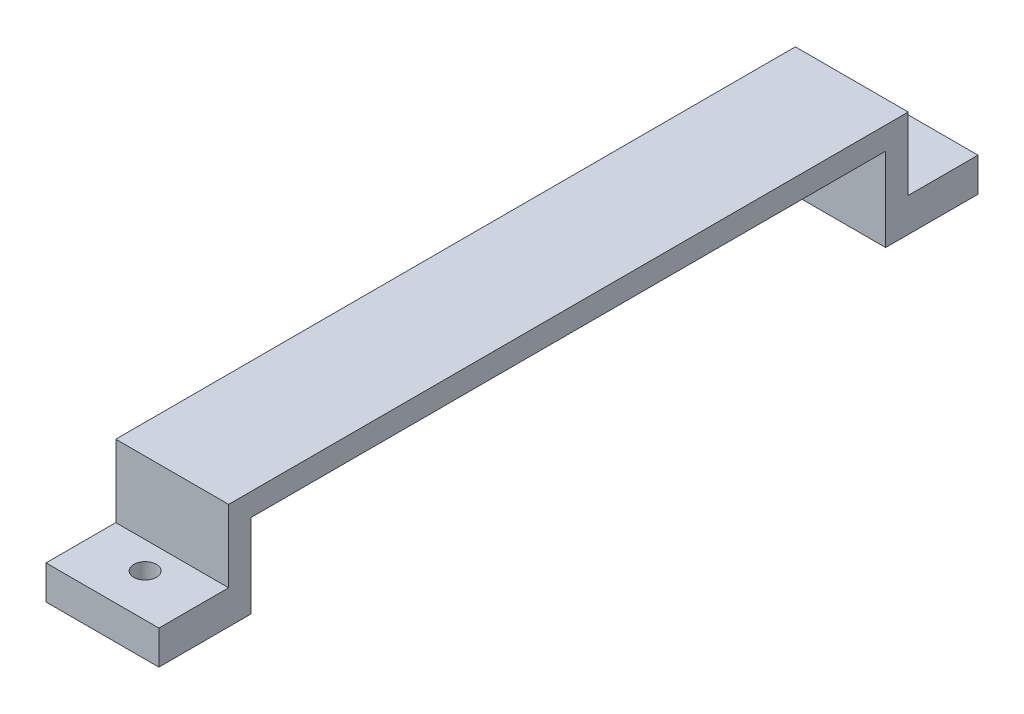
ISO-10303-21;
HEADER;
FILE_DESCRIPTION(('STEP AP214'),'2;1');
FILE_NAME('part.step','',(''),(''),'','','');
FILE_SCHEMA(('AUTOMOTIVE_DESIGN { 1 0 10303 214 1 1 1 1 }'));
ENDSEC;
DATA;
#1=APPLICATION_CONTEXT('core data for automotive mechanical design processes');
#2=APPLICATION_PROTOCOL_DEFINITION('international standard','automotive_design',2000,#1);
#3=PRODUCT_CONTEXT('',#1,'mechanical');
#4=PRODUCT('Part','Part','',(#3));
#5=PRODUCT_RELATED_PRODUCT_CATEGORY('part','',(#4));
#6=PRODUCT_DEFINITION_FORMATION('','',#4);
#7=PRODUCT_DEFINITION_CONTEXT('part definition',#1,'design');
#8=PRODUCT_DEFINITION('design','',#6,#7);
#9=PRODUCT_DEFINITION_SHAPE('','',#8);
#10=(LENGTH_UNIT() NAMED_UNIT(*) SI_UNIT(.MILLI.,.METRE.));
#11=(NAMED_UNIT(*) PLANE_ANGLE_UNIT() SI_UNIT($,.RADIAN.));
#12=(NAMED_UNIT(*) SI_UNIT($,.STERADIAN.) SOLID_ANGLE_UNIT());
#13=UNCERTAINTY_MEASURE_WITH_UNIT(LENGTH_MEASURE(1.E-05),#10,'distance_accuracy_value','');
#14=(GEOMETRIC_REPRESENTATION_CONTEXT(3) GLOBAL_UNCERTAINTY_ASSIGNED_CONTEXT((#13)) GLOBAL_UNIT_ASSIGNED_CONTEXT((#10,
#11,#12)) REPRESENTATION_CONTEXT('',''));
#15=CARTESIAN_POINT('',(0.,0.,0.));
#16=DIRECTION('',(0.,0.,1.));
#17=DIRECTION('',(1.,0.,0.));
#18=AXIS2_PLACEMENT_3D('',#15,#16,#17);
#19=CARTESIAN_POINT('',(5.,1.5,0.));
#20=DIRECTION('',(1.,0.,0.));
#21=DIRECTION('',(0.,0.,-1.));
#22=AXIS2_PLACEMENT_3D('',#19,#20,#21);
#23=PLANE('',#22);
#24=DIRECTION('',(0.,0.,1.));
#25=VECTOR('',#24,1.);
#26=CARTESIAN_POINT('',(5.,1.5,0.));
#27=LINE('',#26,#25);
#28=CARTESIAN_POINT('',(5.,1.5,0.));
#29=VERTEX_POINT('',#28);
#30=CARTESIAN_POINT('',(5.,1.5,3.09));
#31=VERTEX_POINT('',#30);
#32=EDGE_CURVE('E247',#29,#31,#27,.T.);
#33=ORIENTED_EDGE('',*,*,#32,.T.);
#34=DIRECTION('',(0.,-1.,0.));
#35=VECTOR('',#34,1.);
#36=CARTESIAN_POINT('',(5.,3.7,3.09));
#37=LINE('',#36,#35);
#38=CARTESIAN_POINT('',(5.,4.7,3.09));
#39=VERTEX_POINT('',#38);
#40=EDGE_CURVE('E132',#39,#31,#37,.T.);
#41=ORIENTED_EDGE('',*,*,#40,.F.);
#42=DIRECTION('',(0.,0.,-1.));
#43=VECTOR('',#42,1.);
#44=CARTESIAN_POINT('',(5.,4.7,3.09));
#45=LINE('',#44,#43);
#46=CARTESIAN_POINT('',(5.,4.7,33.19));
#47=VERTEX_POINT('',#46);
#48=EDGE_CURVE('E125',#47,#39,#45,.T.);
#49=ORIENTED_EDGE('',*,*,#48,.F.);
#50=DIRECTION('',(0.,-1.,0.));
#51=VECTOR('',#50,1.);
#52=CARTESIAN_POINT('',(5.,3.7,33.19));
#53=LINE('',#52,#51);
#54=CARTESIAN_POINT('',(5.,1.5,33.19));
#55=VERTEX_POINT('',#54);
#56=EDGE_CURVE('E129',#47,#55,#53,.T.);
#57=ORIENTED_EDGE('',*,*,#56,.T.);
#58=DIRECTION('',(0.,0.,-1.));
#59=VECTOR('',#58,1.);
#60=CARTESIAN_POINT('',(5.,1.5,36.28));
#61=LINE('',#60,#59);
#62=CARTESIAN_POINT('',(5.,1.5,36.28));
#63=VERTEX_POINT('',#62);
#64=EDGE_CURVE('E160',#63,#55,#61,.T.);
#65=ORIENTED_EDGE('',*,*,#64,.F.);
#66=DIRECTION('',(0.,-1.,0.));
#67=VECTOR('',#66,1.);
#68=CARTESIAN_POINT('',(5.,1.5,36.28));
#69=LINE('',#68,#67);
#70=CARTESIAN_POINT('',(5.,0.,36.28));
#71=VERTEX_POINT('',#70);
#72=EDGE_CURVE('E183',#63,#71,#69,.T.);
#73=ORIENTED_EDGE('',*,*,#72,.T.);
#74=DIRECTION('',(0.,0.,-1.));
#75=VECTOR('',#74,1.);
#76=CARTESIAN_POINT('',(5.,0.,36.28));
#77=LINE('',#76,#75);
#78=CARTESIAN_POINT('',(5.,0.,32.19));
#79=VERTEX_POINT('',#78);
#80=EDGE_CURVE('E171',#71,#79,#77,.T.);
#81=ORIENTED_EDGE('',*,*,#80,.T.);
#82=DIRECTION('',(0.,-1.,0.));
#83=VECTOR('',#82,1.);
#84=CARTESIAN_POINT('',(5.,1.5,32.19));
#85=LINE('',#84,#83);
#86=CARTESIAN_POINT('',(5.,3.7,32.19));
#87=VERTEX_POINT('',#86);
#88=EDGE_CURVE('E168',#87,#79,#85,.T.);
#89=ORIENTED_EDGE('',*,*,#88,.F.);
#90=DIRECTION('',(0.,0.,-1.));
#91=VECTOR('',#90,1.);
#92=CARTESIAN_POINT('',(5.,3.7,3.09));
#93=LINE('',#92,#91);
#94=CARTESIAN_POINT('',(5.,3.7,4.09));
#95=VERTEX_POINT('',#94);
#96=EDGE_CURVE('E199',#87,#95,#93,.T.);
#97=ORIENTED_EDGE('',*,*,#96,.T.);
#98=DIRECTION('',(0.,-1.,0.));
#99=VECTOR('',#98,1.);
#100=CARTESIAN_POINT('',(5.,1.5,4.09));
#101=LINE('',#100,#99);
#102=CARTESIAN_POINT('',(5.,0.,4.09));
#103=VERTEX_POINT('',#102);
#104=EDGE_CURVE('E218',#95,#103,#101,.T.);
#105=ORIENTED_EDGE('',*,*,#104,.T.);
#106=DIRECTION('',(0.,0.,1.));
#107=VECTOR('',#106,1.);
#108=CARTESIAN_POINT('',(5.,0.,0.));
#109=LINE('',#108,#107);
#110=CARTESIAN_POINT('',(5.,0.,0.));
#111=VERTEX_POINT('',#110);
#112=EDGE_CURVE('E238',#111,#103,#109,.T.);
#113=ORIENTED_EDGE('',*,*,#112,.F.);
#114=DIRECTION('',(0.,-1.,0.));
#115=VECTOR('',#114,1.);
#116=CARTESIAN_POINT('',(5.,1.5,0.));
#117=LINE('',#116,#115);
#118=EDGE_CURVE('E11',#29,#111,#117,.T.);
#119=ORIENTED_EDGE('',*,*,#118,.F.);
#120=EDGE_LOOP('',(#33,#41,#49,#57,#65,#73,#81,#89,#97,#105,#113,#119));
#121=FACE_BOUND('',#120,.T.);
#122=ADVANCED_FACE('F35',(#121),#23,.T.);
#123=CARTESIAN_POINT('',(0.,1.5,0.));
#124=DIRECTION('',(0.,0.,-1.));
#125=DIRECTION('',(-1.,0.,0.));
#126=AXIS2_PLACEMENT_3D('',#123,#124,#125);
#127=PLANE('',#126);
#128=DIRECTION('',(1.,0.,0.));
#129=VECTOR('',#128,1.);
#130=CARTESIAN_POINT('',(0.,0.,0.));
#131=LINE('',#130,#129);
#132=CARTESIAN_POINT('',(0.,0.,0.));
#133=VERTEX_POINT('',#132);
#134=EDGE_CURVE('E235',#133,#111,#131,.T.);
#135=ORIENTED_EDGE('',*,*,#134,.F.);
#136=DIRECTION('',(0.,-1.,0.));
#137=VECTOR('',#136,1.);
#138=CARTESIAN_POINT('',(0.,1.5,0.));
#139=LINE('',#138,#137);
#140=CARTESIAN_POINT('',(0.,1.5,0.));
#141=VERTEX_POINT('',#140);
#142=EDGE_CURVE('E44',#141,#133,#139,.T.);
#143=ORIENTED_EDGE('',*,*,#142,.F.);
#144=DIRECTION('',(1.,0.,0.));
#145=VECTOR('',#144,1.);
#146=CARTESIAN_POINT('',(0.,1.5,0.));
#147=LINE('',#146,#145);
#148=EDGE_CURVE('E244',#141,#29,#147,.T.);
#149=ORIENTED_EDGE('',*,*,#148,.T.);
#150=ORIENTED_EDGE('',*,*,#118,.T.);
#151=EDGE_LOOP('',(#135,#143,#149,#150));
#152=FACE_BOUND('',#151,.T.);
#153=ADVANCED_FACE('F270',(#152),#127,.T.);
#154=CARTESIAN_POINT('',(0.,1.5,0.));
#155=DIRECTION('',(1.,0.,0.));
#156=DIRECTION('',(0.,0.,-1.));
#157=AXIS2_PLACEMENT_3D('',#154,#155,#156);
#158=PLANE('',#157);
#159=DIRECTION('',(0.,0.,1.));
#160=VECTOR('',#159,1.);
#161=CARTESIAN_POINT('',(0.,0.,0.));
#162=LINE('',#161,#160);
#163=CARTESIAN_POINT('',(0.,0.,4.09));
#164=VERTEX_POINT('',#163);
#165=EDGE_CURVE('E233',#133,#164,#162,.T.);
#166=ORIENTED_EDGE('',*,*,#165,.T.);
#167=DIRECTION('',(0.,-1.,0.));
#168=VECTOR('',#167,1.);
#169=CARTESIAN_POINT('',(0.,1.5,4.09));
#170=LINE('',#169,#168);
#171=CARTESIAN_POINT('',(0.,3.7,4.09));
#172=VERTEX_POINT('',#171);
#173=EDGE_CURVE('E221',#172,#164,#170,.T.);
#174=ORIENTED_EDGE('',*,*,#173,.F.);
#175=DIRECTION('',(0.,0.,1.));
#176=VECTOR('',#175,1.);
#177=CARTESIAN_POINT('',(0.,3.7,3.09));
#178=LINE('',#177,#176);
#179=CARTESIAN_POINT('',(0.,3.7,32.19));
#180=VERTEX_POINT('',#179);
#181=EDGE_CURVE('E187',#172,#180,#178,.T.);
#182=ORIENTED_EDGE('',*,*,#181,.T.);
#183=DIRECTION('',(0.,-1.,0.));
#184=VECTOR('',#183,1.);
#185=CARTESIAN_POINT('',(0.,1.5,32.19));
#186=LINE('',#185,#184);
#187=CARTESIAN_POINT('',(0.,0.,32.19));
#188=VERTEX_POINT('',#187);
#189=EDGE_CURVE('E184',#180,#188,#186,.T.);
#190=ORIENTED_EDGE('',*,*,#189,.T.);
#191=DIRECTION('',(0.,0.,-1.));
#192=VECTOR('',#191,1.);
#193=CARTESIAN_POINT('',(0.,0.,36.28));
#194=LINE('',#193,#192);
#195=CARTESIAN_POINT('',(0.,0.,36.28));
#196=VERTEX_POINT('',#195);
#197=EDGE_CURVE('E176',#196,#188,#194,.T.);
#198=ORIENTED_EDGE('',*,*,#197,.F.);
#199=DIRECTION('',(0.,-1.,0.));
#200=VECTOR('',#199,1.);
#201=CARTESIAN_POINT('',(0.,1.5,36.28));
#202=LINE('',#201,#200);
#203=CARTESIAN_POINT('',(0.,1.5,36.28));
#204=VERTEX_POINT('',#203);
#205=EDGE_CURVE('E180',#204,#196,#202,.T.);
#206=ORIENTED_EDGE('',*,*,#205,.F.);
#207=DIRECTION('',(0.,0.,-1.));
#208=VECTOR('',#207,1.);
#209=CARTESIAN_POINT('',(0.,1.5,36.28));
#210=LINE('',#209,#208);
#211=CARTESIAN_POINT('',(0.,1.5,33.19));
#212=VERTEX_POINT('',#211);
#213=EDGE_CURVE('E165',#204,#212,#210,.T.);
#214=ORIENTED_EDGE('',*,*,#213,.T.);
#215=DIRECTION('',(0.,-1.,0.));
#216=VECTOR('',#215,1.);
#217=CARTESIAN_POINT('',(0.,3.7,33.19));
#218=LINE('',#217,#216);
#219=CARTESIAN_POINT('',(0.,4.7,33.19));
#220=VERTEX_POINT('',#219);
#221=EDGE_CURVE('E150',#220,#212,#218,.T.);
#222=ORIENTED_EDGE('',*,*,#221,.F.);
#223=DIRECTION('',(0.,0.,1.));
#224=VECTOR('',#223,1.);
#225=CARTESIAN_POINT('',(0.,4.7,3.09));
#226=LINE('',#225,#224);
#227=CARTESIAN_POINT('',(0.,4.7,3.09));
#228=VERTEX_POINT('',#227);
#229=EDGE_CURVE('E137',#228,#220,#226,.T.);
#230=ORIENTED_EDGE('',*,*,#229,.F.);
#231=DIRECTION('',(0.,-1.,0.));
#232=VECTOR('',#231,1.);
#233=CARTESIAN_POINT('',(0.,3.7,3.09));
#234=LINE('',#233,#232);
#235=CARTESIAN_POINT('',(0.,1.5,3.09));
#236=VERTEX_POINT('',#235);
#237=EDGE_CURVE('E212',#228,#236,#234,.T.);
#238=ORIENTED_EDGE('',*,*,#237,.T.);
#239=DIRECTION('',(0.,0.,1.));
#240=VECTOR('',#239,1.);
#241=CARTESIAN_POINT('',(0.,1.5,0.));
#242=LINE('',#241,#240);
#243=EDGE_CURVE('E52',#141,#236,#242,.T.);
#244=ORIENTED_EDGE('',*,*,#243,.F.);
#245=ORIENTED_EDGE('',*,*,#142,.T.);
#246=EDGE_LOOP('',(#166,#174,#182,#190,#198,#206,#214,#222,#230,#238,#244,#245));
#247=FACE_BOUND('',#246,.T.);
#248=ADVANCED_FACE('F253',(#247),#158,.F.);
#249=CARTESIAN_POINT('',(2.5,1.5,1.89));
#250=DIRECTION('',(0.,-1.,0.));
#251=DIRECTION('',(0.,0.,-1.));
#252=AXIS2_PLACEMENT_3D('',#249,#250,#251);
#253=CYLINDRICAL_SURFACE('',#252,0.5);
#254=CARTESIAN_POINT('',(2.5,1.5,1.89));
#255=DIRECTION('',(0.,1.,0.));
#256=DIRECTION('',(0.,0.,1.));
#257=AXIS2_PLACEMENT_3D('',#254,#255,#256);
#258=CIRCLE('',#257,0.5);
#259=CARTESIAN_POINT('',(2.5,1.5,2.39));
#260=VERTEX_POINT('',#259);
#261=EDGE_CURVE('E232',#260,#260,#258,.T.);
#262=ORIENTED_EDGE('',*,*,#261,.T.);
#263=EDGE_LOOP('',(#262));
#264=FACE_BOUND('',#263,.T.);
#265=CARTESIAN_POINT('',(2.5,0.,1.89));
#266=DIRECTION('',(0.,1.,0.));
#267=DIRECTION('',(0.,0.,1.));
#268=AXIS2_PLACEMENT_3D('',#265,#266,#267);
#269=CIRCLE('',#268,0.5);
#270=CARTESIAN_POINT('',(2.5,0.,2.39));
#271=VERTEX_POINT('',#270);
#272=EDGE_CURVE('E240',#271,#271,#269,.T.);
#273=ORIENTED_EDGE('',*,*,#272,.F.);
#274=EDGE_LOOP('',(#273));
#275=FACE_BOUND('',#274,.T.);
#276=ADVANCED_FACE('F37',(#264,#275),#253,.F.);
#277=CARTESIAN_POINT('',(0.,1.5,4.09));
#278=DIRECTION('',(0.,0.,-1.));
#279=DIRECTION('',(-1.,0.,0.));
#280=AXIS2_PLACEMENT_3D('',#277,#278,#279);
#281=PLANE('',#280);
#282=DIRECTION('',(1.,0.,0.));
#283=VECTOR('',#282,1.);
#284=CARTESIAN_POINT('',(0.,0.,4.09));
#285=LINE('',#284,#283);
#286=EDGE_CURVE('E230',#164,#103,#285,.T.);
#287=ORIENTED_EDGE('',*,*,#286,.T.);
#288=ORIENTED_EDGE('',*,*,#104,.F.);
#289=DIRECTION('',(1.,0.,0.));
#290=VECTOR('',#289,1.);
#291=CARTESIAN_POINT('',(0.,3.7,4.09));
#292=LINE('',#291,#290);
#293=EDGE_CURVE('E202',#172,#95,#292,.T.);
#294=ORIENTED_EDGE('',*,*,#293,.F.);
#295=ORIENTED_EDGE('',*,*,#173,.T.);
#296=EDGE_LOOP('',(#287,#288,#294,#295));
#297=FACE_BOUND('',#296,.T.);
#298=ADVANCED_FACE('F279',(#297),#281,.F.);
#299=CARTESIAN_POINT('',(0.,1.5,0.));
#300=DIRECTION('',(0.,1.,0.));
#301=DIRECTION('',(0.,0.,1.));
#302=AXIS2_PLACEMENT_3D('',#299,#300,#301);
#303=PLANE('',#302);
#304=DIRECTION('',(-1.,0.,0.));
#305=VECTOR('',#304,1.);
#306=CARTESIAN_POINT('',(0.,1.5,3.09));
#307=LINE('',#306,#305);
#308=EDGE_CURVE('E56',#31,#236,#307,.T.);
#309=ORIENTED_EDGE('',*,*,#308,.F.);
#310=ORIENTED_EDGE('',*,*,#32,.F.);
#311=ORIENTED_EDGE('',*,*,#148,.F.);
#312=ORIENTED_EDGE('',*,*,#243,.T.);
#313=EDGE_LOOP('',(#309,#310,#311,#312));
#314=FACE_BOUND('',#313,.T.);
#315=ORIENTED_EDGE('',*,*,#261,.F.);
#316=EDGE_LOOP('',(#315));
#317=FACE_BOUND('',#316,.T.);
#318=ADVANCED_FACE('F265',(#314,#317),#303,.T.);
#319=CARTESIAN_POINT('',(0.,0.,0.));
#320=DIRECTION('',(0.,1.,0.));
#321=DIRECTION('',(0.,0.,1.));
#322=AXIS2_PLACEMENT_3D('',#319,#320,#321);
#323=PLANE('',#322);
#324=ORIENTED_EDGE('',*,*,#272,.T.);
#325=EDGE_LOOP('',(#324));
#326=FACE_BOUND('',#325,.T.);
#327=ORIENTED_EDGE('',*,*,#112,.T.);
#328=ORIENTED_EDGE('',*,*,#286,.F.);
#329=ORIENTED_EDGE('',*,*,#165,.F.);
#330=ORIENTED_EDGE('',*,*,#134,.T.);
#331=EDGE_LOOP('',(#327,#328,#329,#330));
#332=FACE_BOUND('',#331,.T.);
#333=ADVANCED_FACE('F257',(#326,#332),#323,.F.);
#334=CARTESIAN_POINT('',(0.,3.7,3.09));
#335=DIRECTION('',(0.,0.,-1.));
#336=DIRECTION('',(-1.,0.,0.));
#337=AXIS2_PLACEMENT_3D('',#334,#335,#336);
#338=PLANE('',#337);
#339=ORIENTED_EDGE('',*,*,#40,.T.);
#340=ORIENTED_EDGE('',*,*,#308,.T.);
#341=ORIENTED_EDGE('',*,*,#237,.F.);
#342=DIRECTION('',(-1.,0.,0.));
#343=VECTOR('',#342,1.);
#344=CARTESIAN_POINT('',(0.,4.7,3.09));
#345=LINE('',#344,#343);
#346=EDGE_CURVE('E136',#39,#228,#345,.T.);
#347=ORIENTED_EDGE('',*,*,#346,.F.);
#348=EDGE_LOOP('',(#339,#340,#341,#347));
#349=FACE_BOUND('',#348,.T.);
#350=ADVANCED_FACE('F254',(#349),#338,.T.);
#351=CARTESIAN_POINT('',(0.,3.7,0.));
#352=DIRECTION('',(0.,1.,0.));
#353=DIRECTION('',(0.,0.,1.));
#354=AXIS2_PLACEMENT_3D('',#351,#352,#353);
#355=PLANE('',#354);
#356=ORIENTED_EDGE('',*,*,#181,.F.);
#357=ORIENTED_EDGE('',*,*,#293,.T.);
#358=ORIENTED_EDGE('',*,*,#96,.F.);
#359=DIRECTION('',(1.,0.,0.));
#360=VECTOR('',#359,1.);
#361=CARTESIAN_POINT('',(0.,3.7,32.19));
#362=LINE('',#361,#360);
#363=EDGE_CURVE('E146',#180,#87,#362,.T.);
#364=ORIENTED_EDGE('',*,*,#363,.F.);
#365=EDGE_LOOP('',(#356,#357,#358,#364));
#366=FACE_BOUND('',#365,.T.);
#367=ADVANCED_FACE('F256',(#366),#355,.F.);
#368=CARTESIAN_POINT('',(0.,4.7,0.));
#369=DIRECTION('',(0.,1.,0.));
#370=DIRECTION('',(0.,0.,1.));
#371=AXIS2_PLACEMENT_3D('',#368,#369,#370);
#372=PLANE('',#371);
#373=ORIENTED_EDGE('',*,*,#229,.T.);
#374=DIRECTION('',(-1.,0.,0.));
#375=VECTOR('',#374,1.);
#376=CARTESIAN_POINT('',(0.,4.7,33.19));
#377=LINE('',#376,#375);
#378=EDGE_CURVE('E140',#47,#220,#377,.T.);
#379=ORIENTED_EDGE('',*,*,#378,.F.);
#380=ORIENTED_EDGE('',*,*,#48,.T.);
#381=ORIENTED_EDGE('',*,*,#346,.T.);
#382=EDGE_LOOP('',(#373,#379,#380,#381));
#383=FACE_BOUND('',#382,.T.);
#384=ADVANCED_FACE('F141',(#383),#372,.T.);
#385=CARTESIAN_POINT('',(0.,1.5,36.28));
#386=DIRECTION('',(0.,0.,1.));
#387=DIRECTION('',(-1.,0.,0.));
#388=AXIS2_PLACEMENT_3D('',#385,#386,#387);
#389=PLANE('',#388);
#390=DIRECTION('',(1.,0.,0.));
#391=VECTOR('',#390,1.);
#392=CARTESIAN_POINT('',(0.,0.,36.28));
#393=LINE('',#392,#391);
#394=EDGE_CURVE('E174',#196,#71,#393,.T.);
#395=ORIENTED_EDGE('',*,*,#394,.T.);
#396=ORIENTED_EDGE('',*,*,#72,.F.);
#397=DIRECTION('',(1.,0.,0.));
#398=VECTOR('',#397,1.);
#399=CARTESIAN_POINT('',(0.,1.5,36.28));
#400=LINE('',#399,#398);
#401=EDGE_CURVE('E163',#204,#63,#400,.T.);
#402=ORIENTED_EDGE('',*,*,#401,.F.);
#403=ORIENTED_EDGE('',*,*,#205,.T.);
#404=EDGE_LOOP('',(#395,#396,#402,#403));
#405=FACE_BOUND('',#404,.T.);
#406=ADVANCED_FACE('F306',(#405),#389,.T.);
#407=CARTESIAN_POINT('',(2.5,1.5,34.39));
#408=DIRECTION('',(0.,-1.,0.));
#409=DIRECTION('',(0.,0.,1.));
#410=AXIS2_PLACEMENT_3D('',#407,#408,#409);
#411=CYLINDRICAL_SURFACE('',#410,0.5);
#412=CARTESIAN_POINT('',(2.5,1.5,34.39));
#413=DIRECTION('',(0.,-1.,0.));
#414=DIRECTION('',(0.,0.,-1.));
#415=AXIS2_PLACEMENT_3D('',#412,#413,#414);
#416=CIRCLE('',#415,0.5);
#417=CARTESIAN_POINT('',(2.5,1.5,33.89));
#418=VERTEX_POINT('',#417);
#419=EDGE_CURVE('E157',#418,#418,#416,.T.);
#420=ORIENTED_EDGE('',*,*,#419,.F.);
#421=EDGE_LOOP('',(#420));
#422=FACE_BOUND('',#421,.T.);
#423=CARTESIAN_POINT('',(2.5,0.,34.39));
#424=DIRECTION('',(0.,-1.,0.));
#425=DIRECTION('',(0.,0.,-1.));
#426=AXIS2_PLACEMENT_3D('',#423,#424,#425);
#427=CIRCLE('',#426,0.5);
#428=CARTESIAN_POINT('',(2.5,0.,33.89));
#429=VERTEX_POINT('',#428);
#430=EDGE_CURVE('E152',#429,#429,#427,.T.);
#431=ORIENTED_EDGE('',*,*,#430,.T.);
#432=EDGE_LOOP('',(#431));
#433=FACE_BOUND('',#432,.T.);
#434=ADVANCED_FACE('F313',(#422,#433),#411,.F.);
#435=CARTESIAN_POINT('',(0.,1.5,32.19));
#436=DIRECTION('',(0.,0.,1.));
#437=DIRECTION('',(-1.,0.,0.));
#438=AXIS2_PLACEMENT_3D('',#435,#436,#437);
#439=PLANE('',#438);
#440=DIRECTION('',(1.,0.,0.));
#441=VECTOR('',#440,1.);
#442=CARTESIAN_POINT('',(0.,0.,32.19));
#443=LINE('',#442,#441);
#444=EDGE_CURVE('E161',#188,#79,#443,.T.);
#445=ORIENTED_EDGE('',*,*,#444,.F.);
#446=ORIENTED_EDGE('',*,*,#189,.F.);
#447=ORIENTED_EDGE('',*,*,#363,.T.);
#448=ORIENTED_EDGE('',*,*,#88,.T.);
#449=EDGE_LOOP('',(#445,#446,#447,#448));
#450=FACE_BOUND('',#449,.T.);
#451=ADVANCED_FACE('F311',(#450),#439,.F.);
#452=CARTESIAN_POINT('',(0.,1.5,36.28));
#453=DIRECTION('',(0.,1.,0.));
#454=DIRECTION('',(0.,0.,-1.));
#455=AXIS2_PLACEMENT_3D('',#452,#453,#454);
#456=PLANE('',#455);
#457=DIRECTION('',(-1.,0.,0.));
#458=VECTOR('',#457,1.);
#459=CARTESIAN_POINT('',(0.,1.5,33.19));
#460=LINE('',#459,#458);
#461=EDGE_CURVE('E149',#55,#212,#460,.T.);
#462=ORIENTED_EDGE('',*,*,#461,.T.);
#463=ORIENTED_EDGE('',*,*,#213,.F.);
#464=ORIENTED_EDGE('',*,*,#401,.T.);
#465=ORIENTED_EDGE('',*,*,#64,.T.);
#466=EDGE_LOOP('',(#462,#463,#464,#465));
#467=FACE_BOUND('',#466,.T.);
#468=ORIENTED_EDGE('',*,*,#419,.T.);
#469=EDGE_LOOP('',(#468));
#470=FACE_BOUND('',#469,.T.);
#471=ADVANCED_FACE('F309',(#467,#470),#456,.T.);
#472=CARTESIAN_POINT('',(0.,0.,36.28));
#473=DIRECTION('',(0.,1.,0.));
#474=DIRECTION('',(0.,0.,-1.));
#475=AXIS2_PLACEMENT_3D('',#472,#473,#474);
#476=PLANE('',#475);
#477=ORIENTED_EDGE('',*,*,#430,.F.);
#478=EDGE_LOOP('',(#477));
#479=FACE_BOUND('',#478,.T.);
#480=ORIENTED_EDGE('',*,*,#80,.F.);
#481=ORIENTED_EDGE('',*,*,#394,.F.);
#482=ORIENTED_EDGE('',*,*,#197,.T.);
#483=ORIENTED_EDGE('',*,*,#444,.T.);
#484=EDGE_LOOP('',(#480,#481,#482,#483));
#485=FACE_BOUND('',#484,.T.);
#486=ADVANCED_FACE('F303',(#479,#485),#476,.F.);
#487=CARTESIAN_POINT('',(0.,3.7,33.19));
#488=DIRECTION('',(0.,0.,1.));
#489=DIRECTION('',(-1.,0.,0.));
#490=AXIS2_PLACEMENT_3D('',#487,#488,#489);
#491=PLANE('',#490);
#492=ORIENTED_EDGE('',*,*,#56,.F.);
#493=ORIENTED_EDGE('',*,*,#378,.T.);
#494=ORIENTED_EDGE('',*,*,#221,.T.);
#495=ORIENTED_EDGE('',*,*,#461,.F.);
#496=EDGE_LOOP('',(#492,#493,#494,#495));
#497=FACE_BOUND('',#496,.T.);
#498=ADVANCED_FACE('F148',(#497),#491,.T.);
#499=CLOSED_SHELL('',(#122,#153,#248,#276,#298,#318,#333,#350,#367,#384,#406,#434,#451,#471,
#486,#498));
#500=MANIFOLD_SOLID_BREP('B2',#499);
#501=ADVANCED_BREP_SHAPE_REPRESENTATION('',(#18,#500),#14);
#502=SHAPE_DEFINITION_REPRESENTATION(#9,#501);
ENDSEC;
END-ISO-10303-21;
